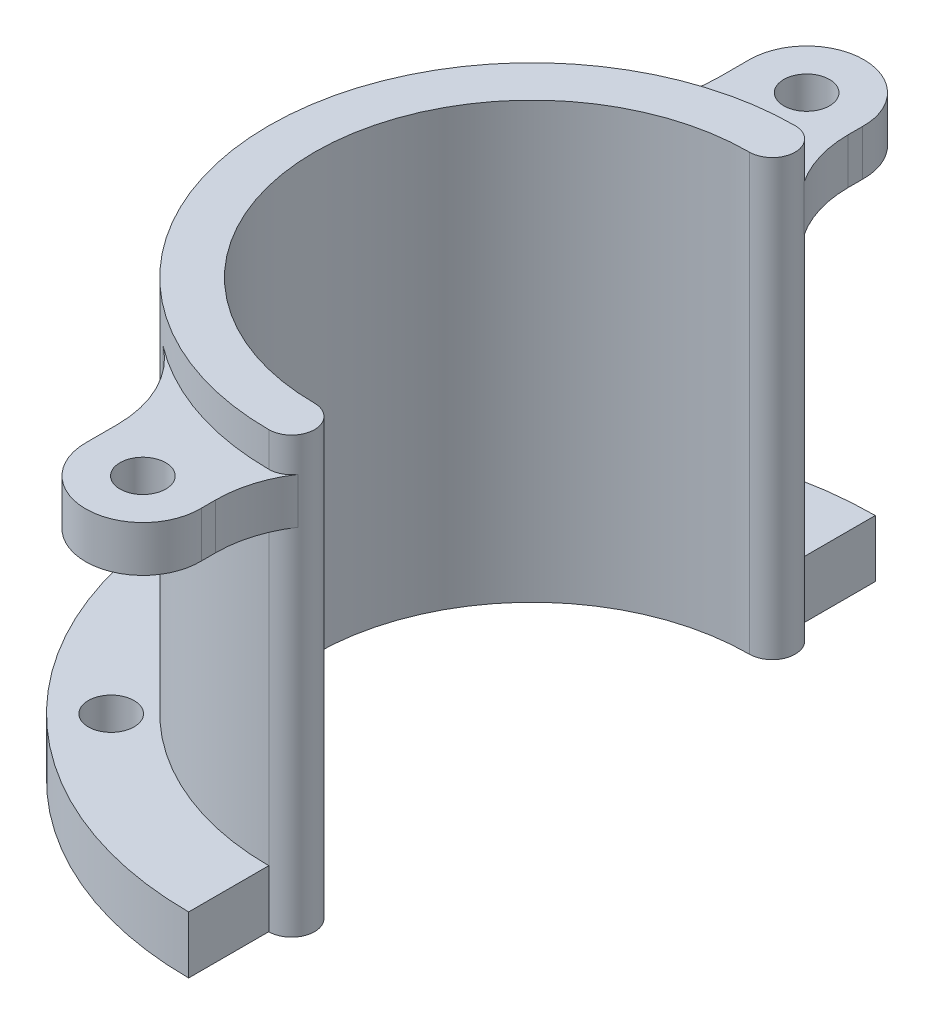
ISO-10303-21;
HEADER;
FILE_DESCRIPTION(('STEP AP214'),'2;1');
FILE_NAME('part.step','',(''),(''),'','','');
FILE_SCHEMA(('AUTOMOTIVE_DESIGN { 1 0 10303 214 1 1 1 1 }'));
ENDSEC;
DATA;
#1=APPLICATION_CONTEXT('core data for automotive mechanical design processes');
#2=APPLICATION_PROTOCOL_DEFINITION('international standard','automotive_design',2000,#1);
#3=PRODUCT_CONTEXT('',#1,'mechanical');
#4=PRODUCT('Part','Part','',(#3));
#5=PRODUCT_RELATED_PRODUCT_CATEGORY('part','',(#4));
#6=PRODUCT_DEFINITION_FORMATION('','',#4);
#7=PRODUCT_DEFINITION_CONTEXT('part definition',#1,'design');
#8=PRODUCT_DEFINITION('design','',#6,#7);
#9=PRODUCT_DEFINITION_SHAPE('','',#8);
#10=(LENGTH_UNIT() NAMED_UNIT(*) SI_UNIT(.MILLI.,.METRE.));
#11=(NAMED_UNIT(*) PLANE_ANGLE_UNIT() SI_UNIT($,.RADIAN.));
#12=(NAMED_UNIT(*) SI_UNIT($,.STERADIAN.) SOLID_ANGLE_UNIT());
#13=UNCERTAINTY_MEASURE_WITH_UNIT(LENGTH_MEASURE(1.E-05),#10,'distance_accuracy_value','');
#14=(GEOMETRIC_REPRESENTATION_CONTEXT(3) GLOBAL_UNCERTAINTY_ASSIGNED_CONTEXT((#13)) GLOBAL_UNIT_ASSIGNED_CONTEXT((#10,
#11,#12)) REPRESENTATION_CONTEXT('',''));
#15=CARTESIAN_POINT('',(0.,0.,0.));
#16=DIRECTION('',(0.,0.,1.));
#17=DIRECTION('',(1.,0.,0.));
#18=AXIS2_PLACEMENT_3D('',#15,#16,#17);
#19=CARTESIAN_POINT('',(0.,38.,0.));
#20=DIRECTION('',(0.,-1.,0.));
#21=DIRECTION('',(0.,0.,-1.));
#22=AXIS2_PLACEMENT_3D('',#19,#20,#21);
#23=CYLINDRICAL_SURFACE('',#22,23.);
#24=DIRECTION('',(0.,-1.,0.));
#25=VECTOR('',#24,1.);
#26=CARTESIAN_POINT('',(-13.9383543040631,38.,18.2954168931567));
#27=LINE('',#26,#25);
#28=CARTESIAN_POINT('',(-13.9383543040632,31.,18.2954168931568));
#29=VERTEX_POINT('',#28);
#30=CARTESIAN_POINT('',(-13.9383543040631,35.,18.2954168931567));
#31=VERTEX_POINT('',#30);
#32=EDGE_CURVE('E335',#29,#31,#27,.F.);
#33=ORIENTED_EDGE('',*,*,#32,.T.);
#34=CARTESIAN_POINT('',(1.64382564092309E-13,35.,-6.97358837342676E-13));
#35=DIRECTION('',(0.,1.,0.));
#36=DIRECTION('',(0.,0.,-1.));
#37=AXIS2_PLACEMENT_3D('',#34,#35,#36);
#38=CIRCLE('',#37,23.0000000000007);
#39=CARTESIAN_POINT('',(0.,35.,23.));
#40=VERTEX_POINT('',#39);
#41=EDGE_CURVE('E204',#31,#40,#38,.T.);
#42=ORIENTED_EDGE('',*,*,#41,.T.);
#43=DIRECTION('',(0.,-1.,0.));
#44=VECTOR('',#43,1.);
#45=CARTESIAN_POINT('',(0.,38.,23.));
#46=LINE('',#45,#44);
#47=CARTESIAN_POINT('',(0.,38.,23.));
#48=VERTEX_POINT('',#47);
#49=EDGE_CURVE('E318',#48,#40,#46,.T.);
#50=ORIENTED_EDGE('',*,*,#49,.F.);
#51=CARTESIAN_POINT('',(0.,38.,0.));
#52=DIRECTION('',(0.,1.,0.));
#53=DIRECTION('',(0.,0.,1.));
#54=AXIS2_PLACEMENT_3D('',#51,#52,#53);
#55=CIRCLE('',#54,23.);
#56=CARTESIAN_POINT('',(0.,38.,-23.));
#57=VERTEX_POINT('',#56);
#58=EDGE_CURVE('E300',#57,#48,#55,.T.);
#59=ORIENTED_EDGE('',*,*,#58,.F.);
#60=DIRECTION('',(0.,-1.,0.));
#61=VECTOR('',#60,1.);
#62=CARTESIAN_POINT('',(0.,38.,-23.));
#63=LINE('',#62,#61);
#64=CARTESIAN_POINT('',(0.,35.,-23.));
#65=VERTEX_POINT('',#64);
#66=EDGE_CURVE('E321',#57,#65,#63,.T.);
#67=ORIENTED_EDGE('',*,*,#66,.T.);
#68=CARTESIAN_POINT('',(1.64382564092309E-13,35.,6.97358837342676E-13));
#69=DIRECTION('',(0.,-1.,0.));
#70=DIRECTION('',(0.,0.,1.));
#71=AXIS2_PLACEMENT_3D('',#68,#69,#70);
#72=CIRCLE('',#71,23.0000000000007);
#73=CARTESIAN_POINT('',(-13.9383543040631,35.,-18.2954168931567));
#74=VERTEX_POINT('',#73);
#75=EDGE_CURVE('E245',#74,#65,#72,.T.);
#76=ORIENTED_EDGE('',*,*,#75,.F.);
#77=DIRECTION('',(0.,-1.,0.));
#78=VECTOR('',#77,1.);
#79=CARTESIAN_POINT('',(-13.9383543040631,38.,-18.2954168931567));
#80=LINE('',#79,#78);
#81=CARTESIAN_POINT('',(-13.9383543040632,31.,-18.2954168931568));
#82=VERTEX_POINT('',#81);
#83=EDGE_CURVE('E332',#74,#82,#80,.T.);
#84=ORIENTED_EDGE('',*,*,#83,.T.);
#85=CARTESIAN_POINT('',(1.64382564092309E-13,31.,6.97358837342676E-13));
#86=DIRECTION('',(0.,-1.,0.));
#87=DIRECTION('',(0.,0.,1.));
#88=AXIS2_PLACEMENT_3D('',#85,#86,#87);
#89=CIRCLE('',#88,23.0000000000007);
#90=CARTESIAN_POINT('',(0.,31.,-23.));
#91=VERTEX_POINT('',#90);
#92=EDGE_CURVE('E234',#82,#91,#89,.T.);
#93=ORIENTED_EDGE('',*,*,#92,.T.);
#94=CARTESIAN_POINT('',(0.,5.,-23.));
#95=VERTEX_POINT('',#94);
#96=EDGE_CURVE('E320',#91,#95,#63,.T.);
#97=ORIENTED_EDGE('',*,*,#96,.T.);
#98=CARTESIAN_POINT('',(0.,5.,0.));
#99=DIRECTION('',(0.,-1.,0.));
#100=DIRECTION('',(0.,0.,1.));
#101=AXIS2_PLACEMENT_3D('',#98,#99,#100);
#102=CIRCLE('',#101,23.);
#103=CARTESIAN_POINT('',(0.,5.,23.));
#104=VERTEX_POINT('',#103);
#105=EDGE_CURVE('E273',#104,#95,#102,.T.);
#106=ORIENTED_EDGE('',*,*,#105,.F.);
#107=CARTESIAN_POINT('',(0.,31.,23.));
#108=VERTEX_POINT('',#107);
#109=EDGE_CURVE('E317',#108,#104,#46,.T.);
#110=ORIENTED_EDGE('',*,*,#109,.F.);
#111=CARTESIAN_POINT('',(1.64382564092309E-13,31.,-6.97358837342676E-13));
#112=DIRECTION('',(0.,1.,0.));
#113=DIRECTION('',(0.,0.,-1.));
#114=AXIS2_PLACEMENT_3D('',#111,#112,#113);
#115=CIRCLE('',#114,23.0000000000007);
#116=EDGE_CURVE('E186',#29,#108,#115,.T.);
#117=ORIENTED_EDGE('',*,*,#116,.F.);
#118=EDGE_LOOP('',(#33,#42,#50,#59,#67,#76,#84,#93,#97,#106,#110,#117));
#119=FACE_BOUND('',#118,.T.);
#120=ADVANCED_FACE('F32',(#119),#23,.T.);
#121=CARTESIAN_POINT('',(0.,38.,-21.));
#122=DIRECTION('',(0.,-1.,0.));
#123=DIRECTION('',(0.,0.,-1.));
#124=AXIS2_PLACEMENT_3D('',#121,#122,#123);
#125=CYLINDRICAL_SURFACE('',#124,2.);
#126=DIRECTION('',(0.,-1.,0.));
#127=VECTOR('',#126,1.);
#128=CARTESIAN_POINT('',(1.66666666666669,38.,-22.1055415967851));
#129=LINE('',#128,#127);
#130=CARTESIAN_POINT('',(1.66666666666669,31.,-22.1055415967851));
#131=VERTEX_POINT('',#130);
#132=CARTESIAN_POINT('',(1.66666666666669,35.,-22.1055415967851));
#133=VERTEX_POINT('',#132);
#134=EDGE_CURVE('E344',#131,#133,#129,.F.);
#135=ORIENTED_EDGE('',*,*,#134,.T.);
#136=CARTESIAN_POINT('',(0.,35.,-21.));
#137=DIRECTION('',(0.,-1.,0.));
#138=DIRECTION('',(0.,0.,-1.));
#139=AXIS2_PLACEMENT_3D('',#136,#137,#138);
#140=CIRCLE('',#139,2.);
#141=EDGE_CURVE('E347',#133,#65,#140,.F.);
#142=ORIENTED_EDGE('',*,*,#141,.T.);
#143=ORIENTED_EDGE('',*,*,#66,.F.);
#144=CARTESIAN_POINT('',(0.,38.,-21.));
#145=DIRECTION('',(0.,1.,0.));
#146=DIRECTION('',(0.,0.,1.));
#147=AXIS2_PLACEMENT_3D('',#144,#145,#146);
#148=CIRCLE('',#147,2.);
#149=CARTESIAN_POINT('',(0.,38.,-19.));
#150=VERTEX_POINT('',#149);
#151=EDGE_CURVE('E297',#150,#57,#148,.T.);
#152=ORIENTED_EDGE('',*,*,#151,.F.);
#153=DIRECTION('',(0.,-1.,0.));
#154=VECTOR('',#153,1.);
#155=CARTESIAN_POINT('',(0.,38.,-19.));
#156=LINE('',#155,#154);
#157=CARTESIAN_POINT('',(0.,0.,-19.));
#158=VERTEX_POINT('',#157);
#159=EDGE_CURVE('E307',#150,#158,#156,.T.);
#160=ORIENTED_EDGE('',*,*,#159,.T.);
#161=CARTESIAN_POINT('',(0.,0.,-21.));
#162=DIRECTION('',(0.,1.,0.));
#163=DIRECTION('',(0.,0.,1.));
#164=AXIS2_PLACEMENT_3D('',#161,#162,#163);
#165=CIRCLE('',#164,2.);
#166=CARTESIAN_POINT('',(0.,0.,-23.));
#167=VERTEX_POINT('',#166);
#168=EDGE_CURVE('E296',#158,#167,#165,.T.);
#169=ORIENTED_EDGE('',*,*,#168,.T.);
#170=DIRECTION('',(0.,-1.,0.));
#171=VECTOR('',#170,1.);
#172=CARTESIAN_POINT('',(0.,5.,-23.));
#173=LINE('',#172,#171);
#174=EDGE_CURVE('E287',#95,#167,#173,.T.);
#175=ORIENTED_EDGE('',*,*,#174,.F.);
#176=ORIENTED_EDGE('',*,*,#96,.F.);
#177=CARTESIAN_POINT('',(0.,31.,-21.));
#178=DIRECTION('',(0.,-1.,0.));
#179=DIRECTION('',(0.,0.,-1.));
#180=AXIS2_PLACEMENT_3D('',#177,#178,#179);
#181=CIRCLE('',#180,2.);
#182=EDGE_CURVE('E46',#91,#131,#181,.T.);
#183=ORIENTED_EDGE('',*,*,#182,.T.);
#184=EDGE_LOOP('',(#135,#142,#143,#152,#160,#169,#175,#176,#183));
#185=FACE_BOUND('',#184,.T.);
#186=ADVANCED_FACE('F379',(#185),#125,.T.);
#187=CARTESIAN_POINT('',(0.,38.,21.));
#188=DIRECTION('',(0.,-1.,0.));
#189=DIRECTION('',(0.,0.,-1.));
#190=AXIS2_PLACEMENT_3D('',#187,#188,#189);
#191=CYLINDRICAL_SURFACE('',#190,2.);
#192=ORIENTED_EDGE('',*,*,#49,.T.);
#193=CARTESIAN_POINT('',(0.,35.,21.));
#194=DIRECTION('',(0.,-1.,0.));
#195=DIRECTION('',(0.,0.,-1.));
#196=AXIS2_PLACEMENT_3D('',#193,#194,#195);
#197=CIRCLE('',#196,2.);
#198=CARTESIAN_POINT('',(1.66666666666667,35.,22.1055415967851));
#199=VERTEX_POINT('',#198);
#200=EDGE_CURVE('E54',#40,#199,#197,.F.);
#201=ORIENTED_EDGE('',*,*,#200,.T.);
#202=DIRECTION('',(0.,-1.,0.));
#203=VECTOR('',#202,1.);
#204=CARTESIAN_POINT('',(1.66666666666667,38.,22.1055415967851));
#205=LINE('',#204,#203);
#206=CARTESIAN_POINT('',(1.66666666666667,31.,22.1055415967851));
#207=VERTEX_POINT('',#206);
#208=EDGE_CURVE('E328',#199,#207,#205,.T.);
#209=ORIENTED_EDGE('',*,*,#208,.T.);
#210=CARTESIAN_POINT('',(0.,31.,21.));
#211=DIRECTION('',(0.,-1.,0.));
#212=DIRECTION('',(0.,0.,-1.));
#213=AXIS2_PLACEMENT_3D('',#210,#211,#212);
#214=CIRCLE('',#213,2.);
#215=EDGE_CURVE('E326',#207,#108,#214,.T.);
#216=ORIENTED_EDGE('',*,*,#215,.T.);
#217=ORIENTED_EDGE('',*,*,#109,.T.);
#218=DIRECTION('',(0.,-1.,0.));
#219=VECTOR('',#218,1.);
#220=CARTESIAN_POINT('',(0.,5.,23.));
#221=LINE('',#220,#219);
#222=CARTESIAN_POINT('',(0.,0.,23.));
#223=VERTEX_POINT('',#222);
#224=EDGE_CURVE('E290',#104,#223,#221,.T.);
#225=ORIENTED_EDGE('',*,*,#224,.T.);
#226=CARTESIAN_POINT('',(0.,0.,21.));
#227=DIRECTION('',(0.,1.,0.));
#228=DIRECTION('',(0.,0.,1.));
#229=AXIS2_PLACEMENT_3D('',#226,#227,#228);
#230=CIRCLE('',#229,2.);
#231=CARTESIAN_POINT('',(0.,0.,19.));
#232=VERTEX_POINT('',#231);
#233=EDGE_CURVE('E309',#223,#232,#230,.T.);
#234=ORIENTED_EDGE('',*,*,#233,.T.);
#235=DIRECTION('',(0.,-1.,0.));
#236=VECTOR('',#235,1.);
#237=CARTESIAN_POINT('',(0.,38.,19.));
#238=LINE('',#237,#236);
#239=CARTESIAN_POINT('',(0.,38.,19.));
#240=VERTEX_POINT('',#239);
#241=EDGE_CURVE('E314',#240,#232,#238,.T.);
#242=ORIENTED_EDGE('',*,*,#241,.F.);
#243=CARTESIAN_POINT('',(0.,38.,21.));
#244=DIRECTION('',(0.,1.,0.));
#245=DIRECTION('',(0.,0.,1.));
#246=AXIS2_PLACEMENT_3D('',#243,#244,#245);
#247=CIRCLE('',#246,2.);
#248=EDGE_CURVE('E303',#48,#240,#247,.T.);
#249=ORIENTED_EDGE('',*,*,#248,.F.);
#250=EDGE_LOOP('',(#192,#201,#209,#216,#217,#225,#234,#242,#249));
#251=FACE_BOUND('',#250,.T.);
#252=ADVANCED_FACE('F411',(#251),#191,.T.);
#253=CARTESIAN_POINT('',(0.,38.,0.));
#254=DIRECTION('',(0.,-1.,0.));
#255=DIRECTION('',(0.,0.,-1.));
#256=AXIS2_PLACEMENT_3D('',#253,#254,#255);
#257=CYLINDRICAL_SURFACE('',#256,19.);
#258=CARTESIAN_POINT('',(0.,0.,0.));
#259=DIRECTION('',(0.,-1.,0.));
#260=DIRECTION('',(0.,0.,1.));
#261=AXIS2_PLACEMENT_3D('',#258,#259,#260);
#262=CIRCLE('',#261,19.);
#263=EDGE_CURVE('E301',#232,#158,#262,.T.);
#264=ORIENTED_EDGE('',*,*,#263,.T.);
#265=ORIENTED_EDGE('',*,*,#159,.F.);
#266=CARTESIAN_POINT('',(0.,38.,0.));
#267=DIRECTION('',(0.,-1.,0.));
#268=DIRECTION('',(0.,0.,1.));
#269=AXIS2_PLACEMENT_3D('',#266,#267,#268);
#270=CIRCLE('',#269,19.);
#271=EDGE_CURVE('E305',#240,#150,#270,.T.);
#272=ORIENTED_EDGE('',*,*,#271,.F.);
#273=ORIENTED_EDGE('',*,*,#241,.T.);
#274=EDGE_LOOP('',(#264,#265,#272,#273));
#275=FACE_BOUND('',#274,.T.);
#276=ADVANCED_FACE('F531',(#275),#257,.F.);
#277=CARTESIAN_POINT('',(0.,38.,-10.5));
#278=DIRECTION('',(0.,1.,0.));
#279=DIRECTION('',(0.,0.,1.));
#280=AXIS2_PLACEMENT_3D('',#277,#278,#279);
#281=PLANE('',#280);
#282=ORIENTED_EDGE('',*,*,#151,.T.);
#283=ORIENTED_EDGE('',*,*,#58,.T.);
#284=ORIENTED_EDGE('',*,*,#248,.T.);
#285=ORIENTED_EDGE('',*,*,#271,.T.);
#286=EDGE_LOOP('',(#282,#283,#284,#285));
#287=FACE_BOUND('',#286,.T.);
#288=ADVANCED_FACE('F599',(#287),#281,.T.);
#289=CARTESIAN_POINT('',(0.,0.,-10.5));
#290=DIRECTION('',(0.,1.,0.));
#291=DIRECTION('',(0.,0.,1.));
#292=AXIS2_PLACEMENT_3D('',#289,#290,#291);
#293=PLANE('',#292);
#294=CARTESIAN_POINT('',(-18.3847763108502,0.,-18.3847763108502));
#295=DIRECTION('',(0.,1.,0.));
#296=DIRECTION('',(0.,0.,1.));
#297=AXIS2_PLACEMENT_3D('',#294,#295,#296);
#298=CIRCLE('',#297,2.);
#299=CARTESIAN_POINT('',(-18.3847763108502,0.,-16.3847763108502));
#300=VERTEX_POINT('',#299);
#301=EDGE_CURVE('E252',#300,#300,#298,.T.);
#302=ORIENTED_EDGE('',*,*,#301,.T.);
#303=EDGE_LOOP('',(#302));
#304=FACE_BOUND('',#303,.T.);
#305=CARTESIAN_POINT('',(-18.3847763108502,0.,18.3847763108502));
#306=DIRECTION('',(0.,-1.,0.));
#307=DIRECTION('',(0.,0.,-1.));
#308=AXIS2_PLACEMENT_3D('',#305,#306,#307);
#309=CIRCLE('',#308,2.);
#310=CARTESIAN_POINT('',(-18.3847763108502,0.,16.3847763108502));
#311=VERTEX_POINT('',#310);
#312=EDGE_CURVE('E257',#311,#311,#309,.T.);
#313=ORIENTED_EDGE('',*,*,#312,.F.);
#314=EDGE_LOOP('',(#313));
#315=FACE_BOUND('',#314,.T.);
#316=ORIENTED_EDGE('',*,*,#168,.F.);
#317=ORIENTED_EDGE('',*,*,#263,.F.);
#318=ORIENTED_EDGE('',*,*,#233,.F.);
#319=DIRECTION('',(0.,0.,-1.));
#320=VECTOR('',#319,1.);
#321=CARTESIAN_POINT('',(0.,0.,30.));
#322=LINE('',#321,#320);
#323=CARTESIAN_POINT('',(0.,0.,30.));
#324=VERTEX_POINT('',#323);
#325=EDGE_CURVE('E281',#324,#223,#322,.T.);
#326=ORIENTED_EDGE('',*,*,#325,.F.);
#327=CARTESIAN_POINT('',(0.,0.,0.));
#328=DIRECTION('',(0.,1.,0.));
#329=DIRECTION('',(0.,0.,-1.));
#330=AXIS2_PLACEMENT_3D('',#327,#328,#329);
#331=CIRCLE('',#330,30.);
#332=CARTESIAN_POINT('',(0.,0.,-30.));
#333=VERTEX_POINT('',#332);
#334=EDGE_CURVE('E263',#333,#324,#331,.T.);
#335=ORIENTED_EDGE('',*,*,#334,.F.);
#336=DIRECTION('',(0.,0.,-1.));
#337=VECTOR('',#336,1.);
#338=CARTESIAN_POINT('',(0.,0.,-30.));
#339=LINE('',#338,#337);
#340=EDGE_CURVE('E270',#167,#333,#339,.T.);
#341=ORIENTED_EDGE('',*,*,#340,.F.);
#342=EDGE_LOOP('',(#316,#317,#318,#326,#335,#341));
#343=FACE_BOUND('',#342,.T.);
#344=ADVANCED_FACE('F594',(#304,#315,#343),#293,.F.);
#345=CARTESIAN_POINT('',(0.,5.,0.));
#346=DIRECTION('',(0.,-1.,0.));
#347=DIRECTION('',(0.,0.,-1.));
#348=AXIS2_PLACEMENT_3D('',#345,#346,#347);
#349=CYLINDRICAL_SURFACE('',#348,30.);
#350=ORIENTED_EDGE('',*,*,#334,.T.);
#351=DIRECTION('',(0.,-1.,0.));
#352=VECTOR('',#351,1.);
#353=CARTESIAN_POINT('',(0.,5.,30.));
#354=LINE('',#353,#352);
#355=CARTESIAN_POINT('',(0.,5.,30.));
#356=VERTEX_POINT('',#355);
#357=EDGE_CURVE('E293',#356,#324,#354,.T.);
#358=ORIENTED_EDGE('',*,*,#357,.F.);
#359=CARTESIAN_POINT('',(0.,5.,0.));
#360=DIRECTION('',(0.,1.,0.));
#361=DIRECTION('',(0.,0.,-1.));
#362=AXIS2_PLACEMENT_3D('',#359,#360,#361);
#363=CIRCLE('',#362,30.);
#364=CARTESIAN_POINT('',(0.,5.,-30.));
#365=VERTEX_POINT('',#364);
#366=EDGE_CURVE('E266',#365,#356,#363,.T.);
#367=ORIENTED_EDGE('',*,*,#366,.F.);
#368=DIRECTION('',(0.,-1.,0.));
#369=VECTOR('',#368,1.);
#370=CARTESIAN_POINT('',(0.,5.,-30.));
#371=LINE('',#370,#369);
#372=EDGE_CURVE('E278',#365,#333,#371,.T.);
#373=ORIENTED_EDGE('',*,*,#372,.T.);
#374=EDGE_LOOP('',(#350,#358,#367,#373));
#375=FACE_BOUND('',#374,.T.);
#376=ADVANCED_FACE('F598',(#375),#349,.T.);
#377=CARTESIAN_POINT('',(0.,5.,30.));
#378=DIRECTION('',(-1.,0.,0.));
#379=DIRECTION('',(0.,0.,1.));
#380=AXIS2_PLACEMENT_3D('',#377,#378,#379);
#381=PLANE('',#380);
#382=ORIENTED_EDGE('',*,*,#325,.T.);
#383=ORIENTED_EDGE('',*,*,#224,.F.);
#384=DIRECTION('',(0.,0.,-1.));
#385=VECTOR('',#384,1.);
#386=CARTESIAN_POINT('',(0.,5.,30.));
#387=LINE('',#386,#385);
#388=EDGE_CURVE('E269',#356,#104,#387,.T.);
#389=ORIENTED_EDGE('',*,*,#388,.F.);
#390=ORIENTED_EDGE('',*,*,#357,.T.);
#391=EDGE_LOOP('',(#382,#383,#389,#390));
#392=FACE_BOUND('',#391,.T.);
#393=ADVANCED_FACE('F617',(#392),#381,.F.);
#394=CARTESIAN_POINT('',(0.,5.,-30.));
#395=DIRECTION('',(-1.,0.,0.));
#396=DIRECTION('',(0.,0.,1.));
#397=AXIS2_PLACEMENT_3D('',#394,#395,#396);
#398=PLANE('',#397);
#399=ORIENTED_EDGE('',*,*,#340,.T.);
#400=ORIENTED_EDGE('',*,*,#372,.F.);
#401=DIRECTION('',(0.,0.,-1.));
#402=VECTOR('',#401,1.);
#403=CARTESIAN_POINT('',(0.,5.,-30.));
#404=LINE('',#403,#402);
#405=EDGE_CURVE('E276',#95,#365,#404,.T.);
#406=ORIENTED_EDGE('',*,*,#405,.F.);
#407=ORIENTED_EDGE('',*,*,#174,.T.);
#408=EDGE_LOOP('',(#399,#400,#406,#407));
#409=FACE_BOUND('',#408,.T.);
#410=ADVANCED_FACE('F586',(#409),#398,.F.);
#411=CARTESIAN_POINT('',(0.,5.,0.));
#412=DIRECTION('',(0.,-1.,0.));
#413=DIRECTION('',(0.,0.,-1.));
#414=AXIS2_PLACEMENT_3D('',#411,#412,#413);
#415=PLANE('',#414);
#416=CARTESIAN_POINT('',(-18.3847763108502,5.,-18.3847763108502));
#417=DIRECTION('',(0.,1.,0.));
#418=DIRECTION('',(0.,0.,1.));
#419=AXIS2_PLACEMENT_3D('',#416,#417,#418);
#420=CIRCLE('',#419,2.);
#421=CARTESIAN_POINT('',(-18.3847763108502,5.,-16.3847763108502));
#422=VERTEX_POINT('',#421);
#423=EDGE_CURVE('E254',#422,#422,#420,.T.);
#424=ORIENTED_EDGE('',*,*,#423,.F.);
#425=EDGE_LOOP('',(#424));
#426=FACE_BOUND('',#425,.T.);
#427=CARTESIAN_POINT('',(-18.3847763108502,5.,18.3847763108502));
#428=DIRECTION('',(0.,-1.,0.));
#429=DIRECTION('',(0.,0.,-1.));
#430=AXIS2_PLACEMENT_3D('',#427,#428,#429);
#431=CIRCLE('',#430,2.);
#432=CARTESIAN_POINT('',(-18.3847763108502,5.,16.3847763108502));
#433=VERTEX_POINT('',#432);
#434=EDGE_CURVE('E260',#433,#433,#431,.T.);
#435=ORIENTED_EDGE('',*,*,#434,.T.);
#436=EDGE_LOOP('',(#435));
#437=FACE_BOUND('',#436,.T.);
#438=ORIENTED_EDGE('',*,*,#366,.T.);
#439=ORIENTED_EDGE('',*,*,#388,.T.);
#440=ORIENTED_EDGE('',*,*,#105,.T.);
#441=ORIENTED_EDGE('',*,*,#405,.T.);
#442=EDGE_LOOP('',(#438,#439,#440,#441));
#443=FACE_BOUND('',#442,.T.);
#444=ADVANCED_FACE('F581',(#426,#437,#443),#415,.F.);
#445=CARTESIAN_POINT('',(-18.3847763108502,5.,18.3847763108502));
#446=DIRECTION('',(0.,-1.,0.));
#447=DIRECTION('',(0.,0.,-1.));
#448=AXIS2_PLACEMENT_3D('',#445,#446,#447);
#449=CYLINDRICAL_SURFACE('',#448,2.);
#450=ORIENTED_EDGE('',*,*,#434,.F.);
#451=EDGE_LOOP('',(#450));
#452=FACE_BOUND('',#451,.T.);
#453=ORIENTED_EDGE('',*,*,#312,.T.);
#454=EDGE_LOOP('',(#453));
#455=FACE_BOUND('',#454,.T.);
#456=ADVANCED_FACE('F402',(#452,#455),#449,.F.);
#457=CARTESIAN_POINT('',(-18.3847763108502,5.,-18.3847763108502));
#458=DIRECTION('',(0.,-1.,0.));
#459=DIRECTION('',(0.,0.,-1.));
#460=AXIS2_PLACEMENT_3D('',#457,#458,#459);
#461=CYLINDRICAL_SURFACE('',#460,2.);
#462=ORIENTED_EDGE('',*,*,#423,.T.);
#463=EDGE_LOOP('',(#462));
#464=FACE_BOUND('',#463,.T.);
#465=ORIENTED_EDGE('',*,*,#301,.F.);
#466=EDGE_LOOP('',(#465));
#467=FACE_BOUND('',#466,.T.);
#468=ADVANCED_FACE('F395',(#464,#467),#461,.F.);
#469=CARTESIAN_POINT('',(-4.99850834930796,31.,-29.));
#470=DIRECTION('',(0.,1.,0.));
#471=DIRECTION('',(0.,0.,1.));
#472=AXIS2_PLACEMENT_3D('',#469,#470,#471);
#473=CYLINDRICAL_SURFACE('',#472,5.);
#474=CARTESIAN_POINT('',(-4.99850834930796,35.,-29.));
#475=DIRECTION('',(0.,1.,0.));
#476=DIRECTION('',(0.,0.,-1.));
#477=AXIS2_PLACEMENT_3D('',#474,#475,#476);
#478=CIRCLE('',#477,5.);
#479=CARTESIAN_POINT('',(0.,35.,-28.8778759569182));
#480=VERTEX_POINT('',#479);
#481=CARTESIAN_POINT('',(-9.99850834930796,35.,-29.));
#482=VERTEX_POINT('',#481);
#483=EDGE_CURVE('E224',#480,#482,#478,.T.);
#484=ORIENTED_EDGE('',*,*,#483,.F.);
#485=DIRECTION('',(0.,1.,0.));
#486=VECTOR('',#485,1.);
#487=CARTESIAN_POINT('',(0.,31.,-28.8778759569182));
#488=LINE('',#487,#486);
#489=CARTESIAN_POINT('',(0.,31.,-28.8778759569182));
#490=VERTEX_POINT('',#489);
#491=EDGE_CURVE('E249',#490,#480,#488,.T.);
#492=ORIENTED_EDGE('',*,*,#491,.F.);
#493=CARTESIAN_POINT('',(-4.99850834930796,31.,-29.));
#494=DIRECTION('',(0.,1.,0.));
#495=DIRECTION('',(0.,0.,-1.));
#496=AXIS2_PLACEMENT_3D('',#493,#494,#495);
#497=CIRCLE('',#496,5.);
#498=CARTESIAN_POINT('',(-9.99850834930796,31.,-29.));
#499=VERTEX_POINT('',#498);
#500=EDGE_CURVE('E227',#490,#499,#497,.T.);
#501=ORIENTED_EDGE('',*,*,#500,.T.);
#502=DIRECTION('',(0.,1.,0.));
#503=VECTOR('',#502,1.);
#504=CARTESIAN_POINT('',(-9.99850834930796,31.,-29.));
#505=LINE('',#504,#503);
#506=EDGE_CURVE('E239',#499,#482,#505,.T.);
#507=ORIENTED_EDGE('',*,*,#506,.T.);
#508=EDGE_LOOP('',(#484,#492,#501,#507));
#509=FACE_BOUND('',#508,.T.);
#510=ADVANCED_FACE('F393',(#509),#473,.T.);
#511=CARTESIAN_POINT('',(0.,31.,-28.8778759569182));
#512=DIRECTION('',(1.,0.,0.));
#513=DIRECTION('',(0.,0.,-1.));
#514=AXIS2_PLACEMENT_3D('',#511,#512,#513);
#515=PLANE('',#514);
#516=DIRECTION('',(0.,0.,-1.));
#517=VECTOR('',#516,1.);
#518=CARTESIAN_POINT('',(0.,35.,-28.8778759569182));
#519=LINE('',#518,#517);
#520=CARTESIAN_POINT('',(0.,35.,-27.6332495807108));
#521=VERTEX_POINT('',#520);
#522=EDGE_CURVE('E231',#521,#480,#519,.T.);
#523=ORIENTED_EDGE('',*,*,#522,.F.);
#524=DIRECTION('',(0.,-1.,0.));
#525=VECTOR('',#524,1.);
#526=CARTESIAN_POINT('',(0.,31.,-27.6332495807108));
#527=LINE('',#526,#525);
#528=CARTESIAN_POINT('',(0.,31.,-27.6332495807108));
#529=VERTEX_POINT('',#528);
#530=EDGE_CURVE('E349',#521,#529,#527,.T.);
#531=ORIENTED_EDGE('',*,*,#530,.T.);
#532=DIRECTION('',(0.,0.,-1.));
#533=VECTOR('',#532,1.);
#534=CARTESIAN_POINT('',(0.,31.,-28.8778759569182));
#535=LINE('',#534,#533);
#536=EDGE_CURVE('E237',#529,#490,#535,.T.);
#537=ORIENTED_EDGE('',*,*,#536,.T.);
#538=ORIENTED_EDGE('',*,*,#491,.T.);
#539=EDGE_LOOP('',(#523,#531,#537,#538));
#540=FACE_BOUND('',#539,.T.);
#541=ADVANCED_FACE('F371',(#540),#515,.T.);
#542=CARTESIAN_POINT('',(-9.99850834930796,31.,-20.7130352867179));
#543=DIRECTION('',(-1.,0.,0.));
#544=DIRECTION('',(0.,0.,1.));
#545=AXIS2_PLACEMENT_3D('',#542,#543,#544);
#546=PLANE('',#545);
#547=DIRECTION('',(0.,0.,1.));
#548=VECTOR('',#547,1.);
#549=CARTESIAN_POINT('',(-9.99850834930796,31.,-20.7130352867179));
#550=LINE('',#549,#548);
#551=CARTESIAN_POINT('',(-9.99850834930796,31.,-26.2499459771379));
#552=VERTEX_POINT('',#551);
#553=EDGE_CURVE('E230',#499,#552,#550,.T.);
#554=ORIENTED_EDGE('',*,*,#553,.T.);
#555=DIRECTION('',(0.,-1.,0.));
#556=VECTOR('',#555,1.);
#557=CARTESIAN_POINT('',(-9.99850834930796,31.,-26.2499459771379));
#558=LINE('',#557,#556);
#559=CARTESIAN_POINT('',(-9.99850834930796,35.,-26.2499459771379));
#560=VERTEX_POINT('',#559);
#561=EDGE_CURVE('E340',#552,#560,#558,.F.);
#562=ORIENTED_EDGE('',*,*,#561,.T.);
#563=DIRECTION('',(0.,0.,1.));
#564=VECTOR('',#563,1.);
#565=CARTESIAN_POINT('',(-9.99850834930796,35.,-20.7130352867179));
#566=LINE('',#565,#564);
#567=EDGE_CURVE('E242',#482,#560,#566,.T.);
#568=ORIENTED_EDGE('',*,*,#567,.F.);
#569=ORIENTED_EDGE('',*,*,#506,.F.);
#570=EDGE_LOOP('',(#554,#562,#568,#569));
#571=FACE_BOUND('',#570,.T.);
#572=ADVANCED_FACE('F389',(#571),#546,.T.);
#573=CARTESIAN_POINT('',(-4.99850834930796,31.,-29.));
#574=DIRECTION('',(0.,-1.,0.));
#575=DIRECTION('',(0.,0.,-1.));
#576=AXIS2_PLACEMENT_3D('',#573,#574,#575);
#577=PLANE('',#576);
#578=CARTESIAN_POINT('',(-4.99850834930796,31.,-29.));
#579=DIRECTION('',(0.,-1.,0.));
#580=DIRECTION('',(0.,0.,-1.));
#581=AXIS2_PLACEMENT_3D('',#578,#579,#580);
#582=CIRCLE('',#581,2.);
#583=CARTESIAN_POINT('',(-4.99850834930796,31.,-31.));
#584=VERTEX_POINT('',#583);
#585=EDGE_CURVE('E219',#584,#584,#582,.T.);
#586=ORIENTED_EDGE('',*,*,#585,.F.);
#587=EDGE_LOOP('',(#586));
#588=FACE_BOUND('',#587,.T.);
#589=ORIENTED_EDGE('',*,*,#500,.F.);
#590=ORIENTED_EDGE('',*,*,#536,.F.);
#591=CARTESIAN_POINT('',(10.,31.,-27.6332495807108));
#592=DIRECTION('',(0.,-1.,0.));
#593=DIRECTION('',(0.,0.,-1.));
#594=AXIS2_PLACEMENT_3D('',#591,#592,#593);
#595=CIRCLE('',#594,10.);
#596=EDGE_CURVE('E11',#529,#131,#595,.F.);
#597=ORIENTED_EDGE('',*,*,#596,.T.);
#598=ORIENTED_EDGE('',*,*,#182,.F.);
#599=ORIENTED_EDGE('',*,*,#92,.F.);
#600=CARTESIAN_POINT('',(-19.998508349308,31.,-26.2499459771379));
#601=DIRECTION('',(0.,-1.,0.));
#602=DIRECTION('',(0.,0.,-1.));
#603=AXIS2_PLACEMENT_3D('',#600,#601,#602);
#604=CIRCLE('',#603,10.);
#605=EDGE_CURVE('E362',#82,#552,#604,.F.);
#606=ORIENTED_EDGE('',*,*,#605,.T.);
#607=ORIENTED_EDGE('',*,*,#553,.F.);
#608=EDGE_LOOP('',(#589,#590,#597,#598,#599,#606,#607));
#609=FACE_BOUND('',#608,.T.);
#610=ADVANCED_FACE('F377',(#588,#609),#577,.T.);
#611=CARTESIAN_POINT('',(-4.99850834930796,35.,-29.));
#612=DIRECTION('',(0.,-1.,0.));
#613=DIRECTION('',(0.,0.,-1.));
#614=AXIS2_PLACEMENT_3D('',#611,#612,#613);
#615=PLANE('',#614);
#616=CARTESIAN_POINT('',(-4.99850834930796,35.,-29.));
#617=DIRECTION('',(0.,-1.,0.));
#618=DIRECTION('',(0.,0.,-1.));
#619=AXIS2_PLACEMENT_3D('',#616,#617,#618);
#620=CIRCLE('',#619,2.);
#621=CARTESIAN_POINT('',(-4.99850834930796,35.,-31.));
#622=VERTEX_POINT('',#621);
#623=EDGE_CURVE('E221',#622,#622,#620,.T.);
#624=ORIENTED_EDGE('',*,*,#623,.T.);
#625=EDGE_LOOP('',(#624));
#626=FACE_BOUND('',#625,.T.);
#627=ORIENTED_EDGE('',*,*,#483,.T.);
#628=ORIENTED_EDGE('',*,*,#567,.T.);
#629=CARTESIAN_POINT('',(-19.998508349308,35.,-26.2499459771379));
#630=DIRECTION('',(0.,-1.,0.));
#631=DIRECTION('',(0.,0.,-1.));
#632=AXIS2_PLACEMENT_3D('',#629,#630,#631);
#633=CIRCLE('',#632,10.);
#634=EDGE_CURVE('E359',#560,#74,#633,.T.);
#635=ORIENTED_EDGE('',*,*,#634,.T.);
#636=ORIENTED_EDGE('',*,*,#75,.T.);
#637=ORIENTED_EDGE('',*,*,#141,.F.);
#638=CARTESIAN_POINT('',(10.,35.,-27.6332495807108));
#639=DIRECTION('',(0.,-1.,0.));
#640=DIRECTION('',(0.,0.,-1.));
#641=AXIS2_PLACEMENT_3D('',#638,#639,#640);
#642=CIRCLE('',#641,10.);
#643=EDGE_CURVE('E40',#133,#521,#642,.T.);
#644=ORIENTED_EDGE('',*,*,#643,.T.);
#645=ORIENTED_EDGE('',*,*,#522,.T.);
#646=EDGE_LOOP('',(#627,#628,#635,#636,#637,#644,#645));
#647=FACE_BOUND('',#646,.T.);
#648=ADVANCED_FACE('F366',(#626,#647),#615,.F.);
#649=CARTESIAN_POINT('',(-4.99850834930796,35.,-29.));
#650=DIRECTION('',(0.,-1.,0.));
#651=DIRECTION('',(0.,0.,-1.));
#652=AXIS2_PLACEMENT_3D('',#649,#650,#651);
#653=CYLINDRICAL_SURFACE('',#652,2.);
#654=ORIENTED_EDGE('',*,*,#623,.F.);
#655=EDGE_LOOP('',(#654));
#656=FACE_BOUND('',#655,.T.);
#657=ORIENTED_EDGE('',*,*,#585,.T.);
#658=EDGE_LOOP('',(#657));
#659=FACE_BOUND('',#658,.T.);
#660=ADVANCED_FACE('F496',(#656,#659),#653,.F.);
#661=CARTESIAN_POINT('',(-4.99850834930796,31.,29.));
#662=DIRECTION('',(0.,1.,0.));
#663=DIRECTION('',(0.,0.,1.));
#664=AXIS2_PLACEMENT_3D('',#661,#662,#663);
#665=CYLINDRICAL_SURFACE('',#664,5.);
#666=CARTESIAN_POINT('',(-4.99850834930796,35.,29.));
#667=DIRECTION('',(0.,-1.,0.));
#668=DIRECTION('',(0.,0.,1.));
#669=AXIS2_PLACEMENT_3D('',#666,#667,#668);
#670=CIRCLE('',#669,5.);
#671=CARTESIAN_POINT('',(0.,35.,28.8778759569182));
#672=VERTEX_POINT('',#671);
#673=CARTESIAN_POINT('',(-9.99850834930796,35.,29.));
#674=VERTEX_POINT('',#673);
#675=EDGE_CURVE('E213',#672,#674,#670,.T.);
#676=ORIENTED_EDGE('',*,*,#675,.T.);
#677=DIRECTION('',(0.,1.,0.));
#678=VECTOR('',#677,1.);
#679=CARTESIAN_POINT('',(-9.99850834930796,31.,29.));
#680=LINE('',#679,#678);
#681=CARTESIAN_POINT('',(-9.99850834930796,31.,29.));
#682=VERTEX_POINT('',#681);
#683=EDGE_CURVE('E196',#682,#674,#680,.T.);
#684=ORIENTED_EDGE('',*,*,#683,.F.);
#685=CARTESIAN_POINT('',(-4.99850834930796,31.,29.));
#686=DIRECTION('',(0.,-1.,0.));
#687=DIRECTION('',(0.,0.,1.));
#688=AXIS2_PLACEMENT_3D('',#685,#686,#687);
#689=CIRCLE('',#688,5.);
#690=CARTESIAN_POINT('',(0.,31.,28.8778759569182));
#691=VERTEX_POINT('',#690);
#692=EDGE_CURVE('E179',#691,#682,#689,.T.);
#693=ORIENTED_EDGE('',*,*,#692,.F.);
#694=DIRECTION('',(0.,1.,0.));
#695=VECTOR('',#694,1.);
#696=CARTESIAN_POINT('',(0.,31.,28.8778759569182));
#697=LINE('',#696,#695);
#698=EDGE_CURVE('E189',#691,#672,#697,.T.);
#699=ORIENTED_EDGE('',*,*,#698,.T.);
#700=EDGE_LOOP('',(#676,#684,#693,#699));
#701=FACE_BOUND('',#700,.T.);
#702=ADVANCED_FACE('F199',(#701),#665,.T.);
#703=CARTESIAN_POINT('',(-9.99850834930796,31.,20.7130352867179));
#704=DIRECTION('',(1.,0.,0.));
#705=DIRECTION('',(0.,0.,-1.));
#706=AXIS2_PLACEMENT_3D('',#703,#704,#705);
#707=PLANE('',#706);
#708=DIRECTION('',(0.,0.,-1.));
#709=VECTOR('',#708,1.);
#710=CARTESIAN_POINT('',(-9.99850834930796,35.,20.7130352867179));
#711=LINE('',#710,#709);
#712=CARTESIAN_POINT('',(-9.99850834930796,35.,26.2499459771379));
#713=VERTEX_POINT('',#712);
#714=EDGE_CURVE('E201',#674,#713,#711,.T.);
#715=ORIENTED_EDGE('',*,*,#714,.T.);
#716=DIRECTION('',(0.,1.,0.));
#717=VECTOR('',#716,1.);
#718=CARTESIAN_POINT('',(-9.99850834930796,31.,26.2499459771379));
#719=LINE('',#718,#717);
#720=CARTESIAN_POINT('',(-9.99850834930796,31.,26.2499459771379));
#721=VERTEX_POINT('',#720);
#722=EDGE_CURVE('E338',#713,#721,#719,.F.);
#723=ORIENTED_EDGE('',*,*,#722,.T.);
#724=DIRECTION('',(0.,0.,-1.));
#725=VECTOR('',#724,1.);
#726=CARTESIAN_POINT('',(-9.99850834930796,31.,20.7130352867179));
#727=LINE('',#726,#725);
#728=EDGE_CURVE('E197',#682,#721,#727,.T.);
#729=ORIENTED_EDGE('',*,*,#728,.F.);
#730=ORIENTED_EDGE('',*,*,#683,.T.);
#731=EDGE_LOOP('',(#715,#723,#729,#730));
#732=FACE_BOUND('',#731,.T.);
#733=ADVANCED_FACE('F476',(#732),#707,.F.);
#734=CARTESIAN_POINT('',(0.,31.,28.8778759569182));
#735=DIRECTION('',(-1.,0.,0.));
#736=DIRECTION('',(0.,0.,1.));
#737=AXIS2_PLACEMENT_3D('',#734,#735,#736);
#738=PLANE('',#737);
#739=DIRECTION('',(0.,0.,1.));
#740=VECTOR('',#739,1.);
#741=CARTESIAN_POINT('',(0.,31.,28.8778759569182));
#742=LINE('',#741,#740);
#743=CARTESIAN_POINT('',(0.,31.,27.6332495807107));
#744=VERTEX_POINT('',#743);
#745=EDGE_CURVE('E174',#744,#691,#742,.T.);
#746=ORIENTED_EDGE('',*,*,#745,.F.);
#747=DIRECTION('',(0.,1.,0.));
#748=VECTOR('',#747,1.);
#749=CARTESIAN_POINT('',(0.,35.,27.6332495807107));
#750=LINE('',#749,#748);
#751=CARTESIAN_POINT('',(0.,35.,27.6332495807107));
#752=VERTEX_POINT('',#751);
#753=EDGE_CURVE('E324',#744,#752,#750,.T.);
#754=ORIENTED_EDGE('',*,*,#753,.T.);
#755=DIRECTION('',(0.,0.,1.));
#756=VECTOR('',#755,1.);
#757=CARTESIAN_POINT('',(0.,35.,28.8778759569182));
#758=LINE('',#757,#756);
#759=EDGE_CURVE('E192',#752,#672,#758,.T.);
#760=ORIENTED_EDGE('',*,*,#759,.T.);
#761=ORIENTED_EDGE('',*,*,#698,.F.);
#762=EDGE_LOOP('',(#746,#754,#760,#761));
#763=FACE_BOUND('',#762,.T.);
#764=ADVANCED_FACE('F190',(#763),#738,.F.);
#765=CARTESIAN_POINT('',(-4.99850834930796,31.,29.));
#766=DIRECTION('',(0.,-1.,0.));
#767=DIRECTION('',(0.,0.,1.));
#768=AXIS2_PLACEMENT_3D('',#765,#766,#767);
#769=PLANE('',#768);
#770=CARTESIAN_POINT('',(-4.99850834930796,31.,29.));
#771=DIRECTION('',(0.,1.,0.));
#772=DIRECTION('',(0.,0.,1.));
#773=AXIS2_PLACEMENT_3D('',#770,#771,#772);
#774=CIRCLE('',#773,2.);
#775=CARTESIAN_POINT('',(-4.99850834930796,31.,31.));
#776=VERTEX_POINT('',#775);
#777=EDGE_CURVE('E207',#776,#776,#774,.T.);
#778=ORIENTED_EDGE('',*,*,#777,.T.);
#779=EDGE_LOOP('',(#778));
#780=FACE_BOUND('',#779,.T.);
#781=ORIENTED_EDGE('',*,*,#692,.T.);
#782=ORIENTED_EDGE('',*,*,#728,.T.);
#783=CARTESIAN_POINT('',(-19.998508349308,31.,26.2499459771379));
#784=DIRECTION('',(0.,-1.,0.));
#785=DIRECTION('',(0.,0.,-1.));
#786=AXIS2_PLACEMENT_3D('',#783,#784,#785);
#787=CIRCLE('',#786,10.);
#788=EDGE_CURVE('E356',#721,#29,#787,.F.);
#789=ORIENTED_EDGE('',*,*,#788,.T.);
#790=ORIENTED_EDGE('',*,*,#116,.T.);
#791=ORIENTED_EDGE('',*,*,#215,.F.);
#792=CARTESIAN_POINT('',(10.,31.,27.6332495807108));
#793=DIRECTION('',(0.,-1.,0.));
#794=DIRECTION('',(0.,0.,-1.));
#795=AXIS2_PLACEMENT_3D('',#792,#793,#794);
#796=CIRCLE('',#795,10.);
#797=EDGE_CURVE('E182',#207,#744,#796,.F.);
#798=ORIENTED_EDGE('',*,*,#797,.T.);
#799=ORIENTED_EDGE('',*,*,#745,.T.);
#800=EDGE_LOOP('',(#781,#782,#789,#790,#791,#798,#799));
#801=FACE_BOUND('',#800,.T.);
#802=ADVANCED_FACE('F176',(#780,#801),#769,.T.);
#803=CARTESIAN_POINT('',(-4.99850834930796,35.,29.));
#804=DIRECTION('',(0.,-1.,0.));
#805=DIRECTION('',(0.,0.,1.));
#806=AXIS2_PLACEMENT_3D('',#803,#804,#805);
#807=PLANE('',#806);
#808=CARTESIAN_POINT('',(-4.99850834930796,35.,29.));
#809=DIRECTION('',(0.,1.,0.));
#810=DIRECTION('',(0.,0.,1.));
#811=AXIS2_PLACEMENT_3D('',#808,#809,#810);
#812=CIRCLE('',#811,2.);
#813=CARTESIAN_POINT('',(-4.99850834930796,35.,31.));
#814=VERTEX_POINT('',#813);
#815=EDGE_CURVE('E215',#814,#814,#812,.T.);
#816=ORIENTED_EDGE('',*,*,#815,.F.);
#817=EDGE_LOOP('',(#816));
#818=FACE_BOUND('',#817,.T.);
#819=ORIENTED_EDGE('',*,*,#675,.F.);
#820=ORIENTED_EDGE('',*,*,#759,.F.);
#821=CARTESIAN_POINT('',(10.,35.,27.6332495807108));
#822=DIRECTION('',(0.,-1.,0.));
#823=DIRECTION('',(0.,0.,-1.));
#824=AXIS2_PLACEMENT_3D('',#821,#822,#823);
#825=CIRCLE('',#824,10.);
#826=EDGE_CURVE('E351',#752,#199,#825,.T.);
#827=ORIENTED_EDGE('',*,*,#826,.T.);
#828=ORIENTED_EDGE('',*,*,#200,.F.);
#829=ORIENTED_EDGE('',*,*,#41,.F.);
#830=CARTESIAN_POINT('',(-19.998508349308,35.,26.2499459771379));
#831=DIRECTION('',(0.,-1.,0.));
#832=DIRECTION('',(0.,0.,-1.));
#833=AXIS2_PLACEMENT_3D('',#830,#831,#832);
#834=CIRCLE('',#833,10.);
#835=EDGE_CURVE('E354',#31,#713,#834,.T.);
#836=ORIENTED_EDGE('',*,*,#835,.T.);
#837=ORIENTED_EDGE('',*,*,#714,.F.);
#838=EDGE_LOOP('',(#819,#820,#827,#828,#829,#836,#837));
#839=FACE_BOUND('',#838,.T.);
#840=ADVANCED_FACE('F453',(#818,#839),#807,.F.);
#841=CARTESIAN_POINT('',(-4.99850834930796,35.,29.));
#842=DIRECTION('',(0.,-1.,0.));
#843=DIRECTION('',(0.,0.,-1.));
#844=AXIS2_PLACEMENT_3D('',#841,#842,#843);
#845=CYLINDRICAL_SURFACE('',#844,2.);
#846=ORIENTED_EDGE('',*,*,#815,.T.);
#847=EDGE_LOOP('',(#846));
#848=FACE_BOUND('',#847,.T.);
#849=ORIENTED_EDGE('',*,*,#777,.F.);
#850=EDGE_LOOP('',(#849));
#851=FACE_BOUND('',#850,.T.);
#852=ADVANCED_FACE('F420',(#848,#851),#845,.F.);
#853=CARTESIAN_POINT('',(10.,38.,27.6332495807108));
#854=DIRECTION('',(0.,-1.,0.));
#855=DIRECTION('',(0.,0.,-1.));
#856=AXIS2_PLACEMENT_3D('',#853,#854,#855);
#857=CYLINDRICAL_SURFACE('',#856,10.);
#858=ORIENTED_EDGE('',*,*,#797,.F.);
#859=ORIENTED_EDGE('',*,*,#208,.F.);
#860=ORIENTED_EDGE('',*,*,#826,.F.);
#861=ORIENTED_EDGE('',*,*,#753,.F.);
#862=EDGE_LOOP('',(#858,#859,#860,#861));
#863=FACE_BOUND('',#862,.T.);
#864=ADVANCED_FACE('F416',(#863),#857,.F.);
#865=CARTESIAN_POINT('',(-19.998508349308,38.,26.2499459771379));
#866=DIRECTION('',(0.,-1.,0.));
#867=DIRECTION('',(0.,0.,-1.));
#868=AXIS2_PLACEMENT_3D('',#865,#866,#867);
#869=CYLINDRICAL_SURFACE('',#868,10.);
#870=ORIENTED_EDGE('',*,*,#788,.F.);
#871=ORIENTED_EDGE('',*,*,#722,.F.);
#872=ORIENTED_EDGE('',*,*,#835,.F.);
#873=ORIENTED_EDGE('',*,*,#32,.F.);
#874=EDGE_LOOP('',(#870,#871,#872,#873));
#875=FACE_BOUND('',#874,.T.);
#876=ADVANCED_FACE('F419',(#875),#869,.F.);
#877=CARTESIAN_POINT('',(-19.998508349308,38.,-26.2499459771379));
#878=DIRECTION('',(0.,-1.,0.));
#879=DIRECTION('',(0.,0.,-1.));
#880=AXIS2_PLACEMENT_3D('',#877,#878,#879);
#881=CYLINDRICAL_SURFACE('',#880,10.);
#882=ORIENTED_EDGE('',*,*,#605,.F.);
#883=ORIENTED_EDGE('',*,*,#83,.F.);
#884=ORIENTED_EDGE('',*,*,#634,.F.);
#885=ORIENTED_EDGE('',*,*,#561,.F.);
#886=EDGE_LOOP('',(#882,#883,#884,#885));
#887=FACE_BOUND('',#886,.T.);
#888=ADVANCED_FACE('F391',(#887),#881,.F.);
#889=CARTESIAN_POINT('',(10.,38.,-27.6332495807108));
#890=DIRECTION('',(0.,-1.,0.));
#891=DIRECTION('',(0.,0.,-1.));
#892=AXIS2_PLACEMENT_3D('',#889,#890,#891);
#893=CYLINDRICAL_SURFACE('',#892,10.);
#894=ORIENTED_EDGE('',*,*,#596,.F.);
#895=ORIENTED_EDGE('',*,*,#530,.F.);
#896=ORIENTED_EDGE('',*,*,#643,.F.);
#897=ORIENTED_EDGE('',*,*,#134,.F.);
#898=EDGE_LOOP('',(#894,#895,#896,#897));
#899=FACE_BOUND('',#898,.T.);
#900=ADVANCED_FACE('F34',(#899),#893,.F.);
#901=CLOSED_SHELL('',(#120,#186,#252,#276,#288,#344,#376,#393,#410,#444,#456,#468,#510,#541,
#572,#610,#648,#660,#702,#733,#764,#802,#840,#852,#864,#876,#888,#900));
#902=MANIFOLD_SOLID_BREP('B2',#901);
#903=ADVANCED_BREP_SHAPE_REPRESENTATION('',(#18,#902),#14);
#904=SHAPE_DEFINITION_REPRESENTATION(#9,#903);
ENDSEC;
END-ISO-10303-21;
